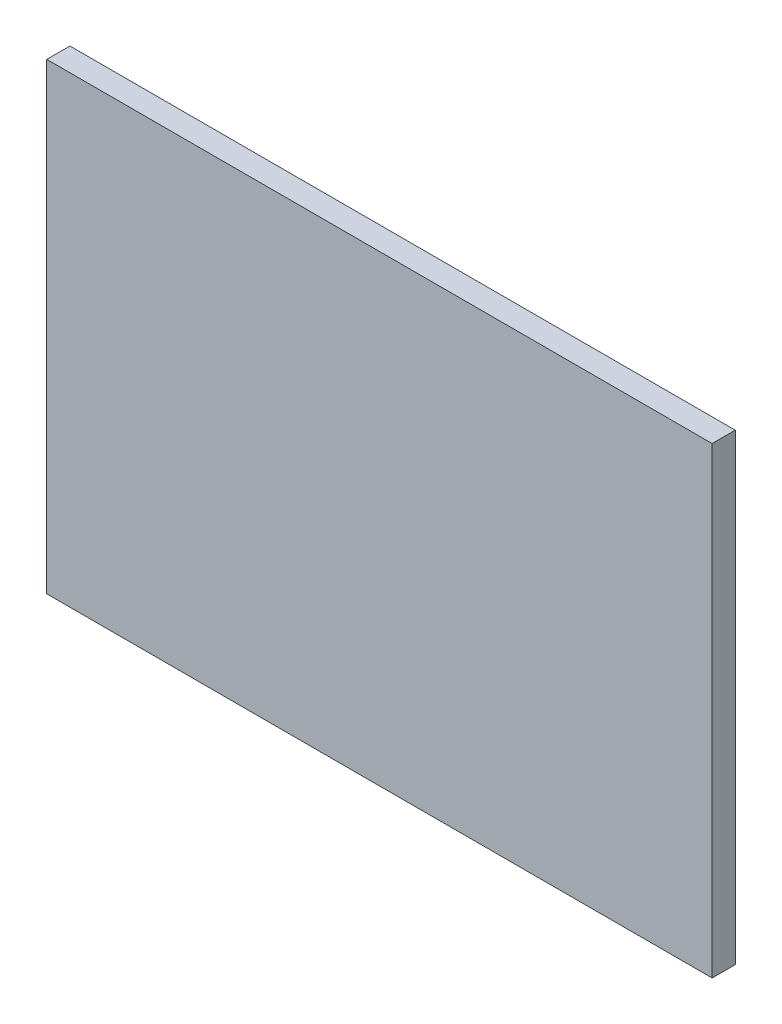
ISO-10303-21;
HEADER;
FILE_DESCRIPTION(('STEP AP214'),'2;1');
FILE_NAME('part.step','',(''),(''),'','','');
FILE_SCHEMA(('AUTOMOTIVE_DESIGN { 1 0 10303 214 1 1 1 1 }'));
ENDSEC;
DATA;
#1=APPLICATION_CONTEXT('core data for automotive mechanical design processes');
#2=APPLICATION_PROTOCOL_DEFINITION('international standard','automotive_design',2000,#1);
#3=PRODUCT_CONTEXT('',#1,'mechanical');
#4=PRODUCT('Part','Part','',(#3));
#5=PRODUCT_RELATED_PRODUCT_CATEGORY('part','',(#4));
#6=PRODUCT_DEFINITION_FORMATION('','',#4);
#7=PRODUCT_DEFINITION_CONTEXT('part definition',#1,'design');
#8=PRODUCT_DEFINITION('design','',#6,#7);
#9=PRODUCT_DEFINITION_SHAPE('','',#8);
#10=(LENGTH_UNIT() NAMED_UNIT(*) SI_UNIT(.MILLI.,.METRE.));
#11=(NAMED_UNIT(*) PLANE_ANGLE_UNIT() SI_UNIT($,.RADIAN.));
#12=(NAMED_UNIT(*) SI_UNIT($,.STERADIAN.) SOLID_ANGLE_UNIT());
#13=UNCERTAINTY_MEASURE_WITH_UNIT(LENGTH_MEASURE(1.E-05),#10,'distance_accuracy_value','');
#14=(GEOMETRIC_REPRESENTATION_CONTEXT(3) GLOBAL_UNCERTAINTY_ASSIGNED_CONTEXT((#13)) GLOBAL_UNIT_ASSIGNED_CONTEXT((#10,
#11,#12)) REPRESENTATION_CONTEXT('',''));
#15=CARTESIAN_POINT('',(0.,0.,0.));
#16=DIRECTION('',(0.,0.,1.));
#17=DIRECTION('',(1.,0.,0.));
#18=AXIS2_PLACEMENT_3D('',#15,#16,#17);
#19=CARTESIAN_POINT('',(-115.,-79.99999999999,8.));
#20=DIRECTION('',(0.,0.,1.));
#21=DIRECTION('',(0.,-1.,0.));
#22=AXIS2_PLACEMENT_3D('',#19,#20,#21);
#23=PLANE('',#22);
#24=DIRECTION('',(0.,1.,0.));
#25=VECTOR('',#24,1.);
#26=CARTESIAN_POINT('',(-115.,-79.99999999999,8.));
#27=LINE('',#26,#25);
#28=CARTESIAN_POINT('',(-115.,-80.,8.));
#29=VERTEX_POINT('',#28);
#30=CARTESIAN_POINT('',(-115.,80.,8.));
#31=VERTEX_POINT('',#30);
#32=EDGE_CURVE('E60',#29,#31,#27,.T.);
#33=ORIENTED_EDGE('',*,*,#32,.F.);
#34=DIRECTION('',(1.,0.,0.));
#35=VECTOR('',#34,1.);
#36=CARTESIAN_POINT('',(-115.,-79.99999999999,8.));
#37=LINE('',#36,#35);
#38=CARTESIAN_POINT('',(115.,-80.,8.));
#39=VERTEX_POINT('',#38);
#40=EDGE_CURVE('E54',#29,#39,#37,.T.);
#41=ORIENTED_EDGE('',*,*,#40,.T.);
#42=DIRECTION('',(0.,1.,0.));
#43=VECTOR('',#42,1.);
#44=CARTESIAN_POINT('',(115.,-80.,8.));
#45=LINE('',#44,#43);
#46=CARTESIAN_POINT('',(115.,80.,8.));
#47=VERTEX_POINT('',#46);
#48=EDGE_CURVE('E56',#39,#47,#45,.T.);
#49=ORIENTED_EDGE('',*,*,#48,.T.);
#50=DIRECTION('',(1.,0.,0.));
#51=VECTOR('',#50,1.);
#52=CARTESIAN_POINT('',(-115.,80.000000000001,8.));
#53=LINE('',#52,#51);
#54=EDGE_CURVE('E11',#31,#47,#53,.T.);
#55=ORIENTED_EDGE('',*,*,#54,.F.);
#56=EDGE_LOOP('',(#33,#41,#49,#55));
#57=FACE_BOUND('',#56,.T.);
#58=ADVANCED_FACE('F17',(#57),#23,.T.);
#59=CARTESIAN_POINT('',(-115.,-79.99999999999,3.410605131648E-13));
#60=DIRECTION('',(0.,0.,1.));
#61=DIRECTION('',(0.,-1.,0.));
#62=AXIS2_PLACEMENT_3D('',#59,#60,#61);
#63=PLANE('',#62);
#64=DIRECTION('',(1.,0.,0.));
#65=VECTOR('',#64,1.);
#66=CARTESIAN_POINT('',(-115.,80.000000000001,3.410605131648E-13));
#67=LINE('',#66,#65);
#68=CARTESIAN_POINT('',(-115.,80.,0.));
#69=VERTEX_POINT('',#68);
#70=CARTESIAN_POINT('',(115.,80.,4.547473508865E-13));
#71=VERTEX_POINT('',#70);
#72=EDGE_CURVE('E27',#69,#71,#67,.T.);
#73=ORIENTED_EDGE('',*,*,#72,.T.);
#74=DIRECTION('',(0.,1.,0.));
#75=VECTOR('',#74,1.);
#76=CARTESIAN_POINT('',(115.,-80.,3.410605131648E-13));
#77=LINE('',#76,#75);
#78=CARTESIAN_POINT('',(115.,-80.,4.547473508865E-13));
#79=VERTEX_POINT('',#78);
#80=EDGE_CURVE('E79',#79,#71,#77,.T.);
#81=ORIENTED_EDGE('',*,*,#80,.F.);
#82=DIRECTION('',(1.,0.,0.));
#83=VECTOR('',#82,1.);
#84=CARTESIAN_POINT('',(-115.,-79.99999999999,3.410605131648E-13));
#85=LINE('',#84,#83);
#86=CARTESIAN_POINT('',(-115.,-80.,0.));
#87=VERTEX_POINT('',#86);
#88=EDGE_CURVE('E66',#87,#79,#85,.T.);
#89=ORIENTED_EDGE('',*,*,#88,.F.);
#90=DIRECTION('',(0.,1.,0.));
#91=VECTOR('',#90,1.);
#92=CARTESIAN_POINT('',(-115.,-79.99999999999,3.410605131648E-13));
#93=LINE('',#92,#91);
#94=EDGE_CURVE('E88',#87,#69,#93,.T.);
#95=ORIENTED_EDGE('',*,*,#94,.T.);
#96=EDGE_LOOP('',(#73,#81,#89,#95));
#97=FACE_BOUND('',#96,.T.);
#98=ADVANCED_FACE('F19',(#97),#63,.F.);
#99=CARTESIAN_POINT('',(-115.,80.000000000001,3.410605131648E-13));
#100=DIRECTION('',(0.,1.,0.));
#101=DIRECTION('',(1.,0.,0.));
#102=AXIS2_PLACEMENT_3D('',#99,#100,#101);
#103=PLANE('',#102);
#104=ORIENTED_EDGE('',*,*,#72,.F.);
#105=DIRECTION('',(0.,0.,1.));
#106=VECTOR('',#105,1.);
#107=CARTESIAN_POINT('',(-115.,80.000000000001,3.410605131648E-13));
#108=LINE('',#107,#106);
#109=EDGE_CURVE('E92',#69,#31,#108,.T.);
#110=ORIENTED_EDGE('',*,*,#109,.T.);
#111=ORIENTED_EDGE('',*,*,#54,.T.);
#112=DIRECTION('',(0.,0.,1.));
#113=VECTOR('',#112,1.);
#114=CARTESIAN_POINT('',(115.,80.000000000001,3.410605131648E-13));
#115=LINE('',#114,#113);
#116=EDGE_CURVE('E72',#71,#47,#115,.T.);
#117=ORIENTED_EDGE('',*,*,#116,.F.);
#118=EDGE_LOOP('',(#104,#110,#111,#117));
#119=FACE_BOUND('',#118,.T.);
#120=ADVANCED_FACE('F136',(#119),#103,.T.);
#121=CARTESIAN_POINT('',(-115.,-79.99999999999,3.410605131648E-13));
#122=DIRECTION('',(0.,1.,0.));
#123=DIRECTION('',(1.,0.,0.));
#124=AXIS2_PLACEMENT_3D('',#121,#122,#123);
#125=PLANE('',#124);
#126=DIRECTION('',(0.,0.,1.));
#127=VECTOR('',#126,1.);
#128=CARTESIAN_POINT('',(115.,-80.,3.410605131648E-13));
#129=LINE('',#128,#127);
#130=EDGE_CURVE('E71',#79,#39,#129,.T.);
#131=ORIENTED_EDGE('',*,*,#130,.T.);
#132=ORIENTED_EDGE('',*,*,#40,.F.);
#133=DIRECTION('',(0.,0.,1.));
#134=VECTOR('',#133,1.);
#135=CARTESIAN_POINT('',(-115.,-79.99999999999,3.410605131648E-13));
#136=LINE('',#135,#134);
#137=EDGE_CURVE('E80',#87,#29,#136,.T.);
#138=ORIENTED_EDGE('',*,*,#137,.F.);
#139=ORIENTED_EDGE('',*,*,#88,.T.);
#140=EDGE_LOOP('',(#131,#132,#138,#139));
#141=FACE_BOUND('',#140,.T.);
#142=ADVANCED_FACE('F75',(#141),#125,.F.);
#143=CARTESIAN_POINT('',(115.,-80.,3.410605131648E-13));
#144=DIRECTION('',(1.,0.,0.));
#145=DIRECTION('',(0.,-1.,0.));
#146=AXIS2_PLACEMENT_3D('',#143,#144,#145);
#147=PLANE('',#146);
#148=ORIENTED_EDGE('',*,*,#130,.F.);
#149=ORIENTED_EDGE('',*,*,#80,.T.);
#150=ORIENTED_EDGE('',*,*,#116,.T.);
#151=ORIENTED_EDGE('',*,*,#48,.F.);
#152=EDGE_LOOP('',(#148,#149,#150,#151));
#153=FACE_BOUND('',#152,.T.);
#154=ADVANCED_FACE('F69',(#153),#147,.T.);
#155=CARTESIAN_POINT('',(-115.,-79.99999999999,3.410605131648E-13));
#156=DIRECTION('',(1.,0.,0.));
#157=DIRECTION('',(0.,-1.,0.));
#158=AXIS2_PLACEMENT_3D('',#155,#156,#157);
#159=PLANE('',#158);
#160=ORIENTED_EDGE('',*,*,#32,.T.);
#161=ORIENTED_EDGE('',*,*,#109,.F.);
#162=ORIENTED_EDGE('',*,*,#94,.F.);
#163=ORIENTED_EDGE('',*,*,#137,.T.);
#164=EDGE_LOOP('',(#160,#161,#162,#163));
#165=FACE_BOUND('',#164,.T.);
#166=ADVANCED_FACE('F110',(#165),#159,.F.);
#167=CLOSED_SHELL('',(#58,#98,#120,#142,#154,#166));
#168=MANIFOLD_SOLID_BREP('B1',#167);
#169=ADVANCED_BREP_SHAPE_REPRESENTATION('',(#18,#168),#14);
#170=SHAPE_DEFINITION_REPRESENTATION(#9,#169);
ENDSEC;
END-ISO-10303-21;
